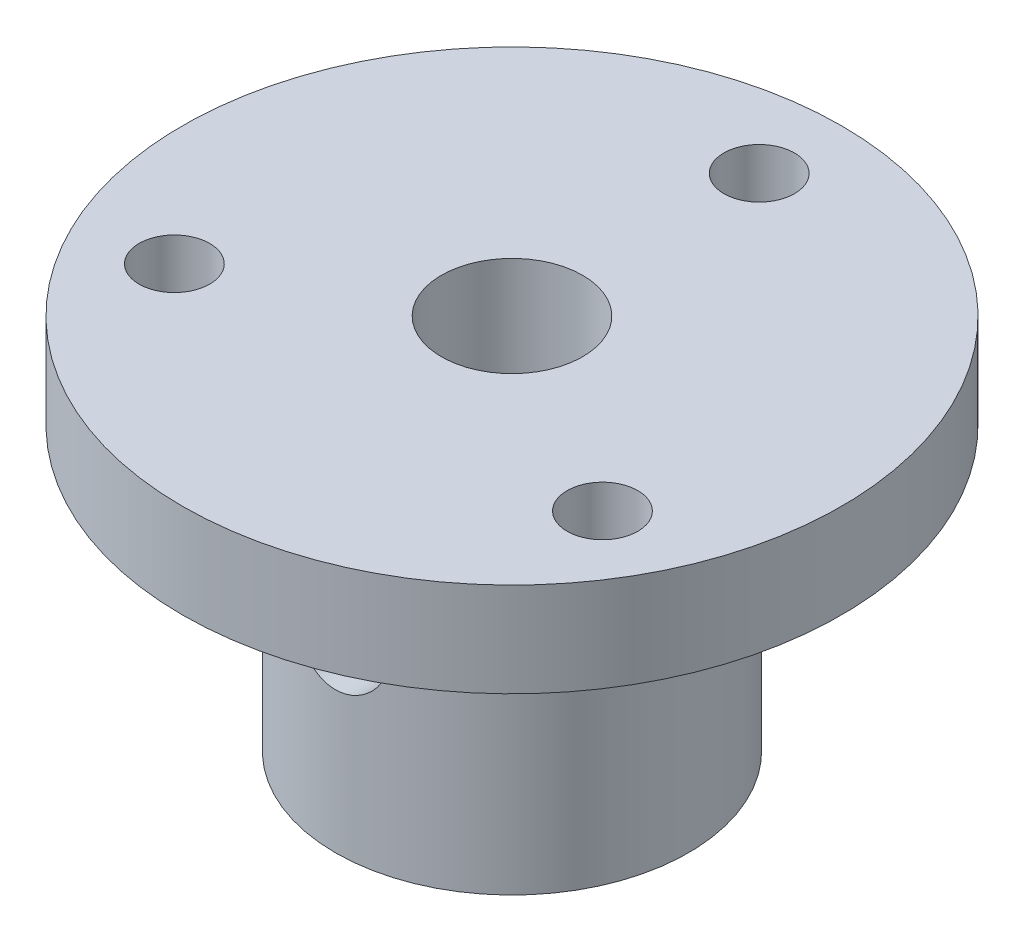
ISO-10303-21;
HEADER;
FILE_DESCRIPTION(('STEP AP214'),'2;1');
FILE_NAME('part.step','',(''),(''),'','','');
FILE_SCHEMA(('AUTOMOTIVE_DESIGN { 1 0 10303 214 1 1 1 1 }'));
ENDSEC;
DATA;
#1=APPLICATION_CONTEXT('core data for automotive mechanical design processes');
#2=APPLICATION_PROTOCOL_DEFINITION('international standard','automotive_design',2000,#1);
#3=PRODUCT_CONTEXT('',#1,'mechanical');
#4=PRODUCT('Part','Part','',(#3));
#5=PRODUCT_RELATED_PRODUCT_CATEGORY('part','',(#4));
#6=PRODUCT_DEFINITION_FORMATION('','',#4);
#7=PRODUCT_DEFINITION_CONTEXT('part definition',#1,'design');
#8=PRODUCT_DEFINITION('design','',#6,#7);
#9=PRODUCT_DEFINITION_SHAPE('','',#8);
#10=(LENGTH_UNIT() NAMED_UNIT(*) SI_UNIT(.MILLI.,.METRE.));
#11=(NAMED_UNIT(*) PLANE_ANGLE_UNIT() SI_UNIT($,.RADIAN.));
#12=(NAMED_UNIT(*) SI_UNIT($,.STERADIAN.) SOLID_ANGLE_UNIT());
#13=UNCERTAINTY_MEASURE_WITH_UNIT(LENGTH_MEASURE(1.E-05),#10,'distance_accuracy_value','');
#14=(GEOMETRIC_REPRESENTATION_CONTEXT(3) GLOBAL_UNCERTAINTY_ASSIGNED_CONTEXT((#13)) GLOBAL_UNIT_ASSIGNED_CONTEXT((#10,
#11,#12)) REPRESENTATION_CONTEXT('',''));
#15=CARTESIAN_POINT('',(0.,0.,0.));
#16=DIRECTION('',(0.,0.,1.));
#17=DIRECTION('',(1.,0.,0.));
#18=AXIS2_PLACEMENT_3D('',#15,#16,#17);
#19=CARTESIAN_POINT('',(0.,0.,0.));
#20=DIRECTION('',(0.,-1.,0.));
#21=DIRECTION('',(0.,0.,-1.));
#22=AXIS2_PLACEMENT_3D('',#19,#20,#21);
#23=CYLINDRICAL_SURFACE('',#22,3.);
#24=CARTESIAN_POINT('',(0.,16.,0.));
#25=DIRECTION('',(0.,-1.,0.));
#26=DIRECTION('',(0.,0.,-1.));
#27=AXIS2_PLACEMENT_3D('',#24,#25,#26);
#28=CIRCLE('',#27,3.);
#29=CARTESIAN_POINT('',(0.,16.,-3.));
#30=VERTEX_POINT('',#29);
#31=EDGE_CURVE('E43',#30,#30,#28,.T.);
#32=ORIENTED_EDGE('',*,*,#31,.F.);
#33=EDGE_LOOP('',(#32));
#34=FACE_BOUND('',#33,.T.);
#35=CARTESIAN_POINT('',(0.,0.,0.));
#36=DIRECTION('',(0.,-1.,0.));
#37=DIRECTION('',(0.,0.,-1.));
#38=AXIS2_PLACEMENT_3D('',#35,#36,#37);
#39=CIRCLE('',#38,3.);
#40=CARTESIAN_POINT('',(0.,0.,-3.));
#41=VERTEX_POINT('',#40);
#42=EDGE_CURVE('E10',#41,#41,#39,.T.);
#43=ORIENTED_EDGE('',*,*,#42,.T.);
#44=EDGE_LOOP('',(#43));
#45=FACE_BOUND('',#44,.T.);
#46=CARTESIAN_POINT('',(-2.,8.,2.23606797749979));
#47=CARTESIAN_POINT('',(-1.99999453997731,8.09762831086862,2.23607753462817));
#48=CARTESIAN_POINT('',(-1.99278992503664,8.1952907537088,2.24258071047442));
#49=CARTESIAN_POINT('',(-1.96458268317731,8.38711991165081,2.26731972501617));
#50=CARTESIAN_POINT('',(-1.94355530587862,8.48128003552957,2.2855766081271));
#51=CARTESIAN_POINT('',(-1.88935861676632,8.66273544187768,2.3305658582557));
#52=CARTESIAN_POINT('',(-1.85630718014214,8.75008769673766,2.35721561794601));
#53=CARTESIAN_POINT('',(-1.77934008393538,8.91786583234666,2.41584094681825));
#54=CARTESIAN_POINT('',(-1.73542216812163,8.99829026997647,2.44781762158831));
#55=CARTESIAN_POINT('',(-1.63002410007714,9.16364688761691,2.51946072932026));
#56=CARTESIAN_POINT('',(-1.56687435451732,9.2473321177172,2.55954936090364));
#57=CARTESIAN_POINT('',(-1.4281921974068,9.40400270887428,2.63944827308083));
#58=CARTESIAN_POINT('',(-1.3526477317708,9.47697752165853,2.67925824297985));
#59=CARTESIAN_POINT('',(-1.17815690494295,9.62064365878167,2.76088818523747));
#60=CARTESIAN_POINT('',(-1.07740643965819,9.68948251177567,2.80216785846923));
#61=CARTESIAN_POINT('',(-0.862470964212233,9.80864209549007,2.87558484482764));
#62=CARTESIAN_POINT('',(-0.748301152321705,9.85898351403119,2.90773236231037));
#63=CARTESIAN_POINT('',(-0.523249073480004,9.93355640101745,2.95599907464725));
#64=CARTESIAN_POINT('',(-0.413434725181417,9.96008334449556,2.97351175615867));
#65=CARTESIAN_POINT('',(-0.189695448729863,9.99418448928365,2.99609745461921));
#66=CARTESIAN_POINT('',(-0.0757758812858259,10.0017825592254,3.00118613762359));
#67=CARTESIAN_POINT('',(0.134147050232329,9.99782755005095,2.99855361722953));
#68=CARTESIAN_POINT('',(0.230240638008752,9.98901094868294,2.99266264910127));
#69=CARTESIAN_POINT('',(0.419238633271015,9.95790894864109,2.9720818279002));
#70=CARTESIAN_POINT('',(0.512142807649723,9.93562256769646,2.95739133313102));
#71=CARTESIAN_POINT('',(0.692077937671168,9.87880431520542,2.92052091703736));
#72=CARTESIAN_POINT('',(0.77913062384596,9.84432111480144,2.89837077982679));
#73=CARTESIAN_POINT('',(0.946209150653555,9.76444635704718,2.84821104476287));
#74=CARTESIAN_POINT('',(1.0262337049694,9.71905280849849,2.82020037745161));
#75=CARTESIAN_POINT('',(1.18828429196344,9.61202126254011,2.75618058450702));
#76=CARTESIAN_POINT('',(1.26919148099708,9.54903247664721,2.71960408792025));
#77=CARTESIAN_POINT('',(1.41998807498305,9.41210132051968,2.64400601826998));
#78=CARTESIAN_POINT('',(1.48986013519457,9.33814205406619,2.60498072815232));
#79=CARTESIAN_POINT('',(1.62772235326165,9.16803678978671,2.52150044944152));
#80=CARTESIAN_POINT('',(1.69373593126354,9.07022892028551,2.47714320008932));
#81=CARTESIAN_POINT('',(1.80834874945482,8.86249016077929,2.39475610831095));
#82=CARTESIAN_POINT('',(1.85697718654898,8.7525800055861,2.3567157153489));
#83=CARTESIAN_POINT('',(1.92332724567776,8.5552809379269,2.30262870306889));
#84=CARTESIAN_POINT('',(1.94590791747533,8.47040662994313,2.28340364577668));
#85=CARTESIAN_POINT('',(1.97979555580014,8.29696051018316,2.25409039789612));
#86=CARTESIAN_POINT('',(1.99112206964395,8.20839538882738,2.24398636782354));
#87=CARTESIAN_POINT('',(2.00179400148877,8.02955701355851,2.23447556987372));
#88=CARTESIAN_POINT('',(2.00108729753098,7.93927802147988,2.2351153386647));
#89=CARTESIAN_POINT('',(1.98761629716365,7.76031616604496,2.24709880368953));
#90=CARTESIAN_POINT('',(1.97484222690381,7.67163465589262,2.25845117648851));
#91=CARTESIAN_POINT('',(1.93899811187046,7.50261058245016,2.28927977500747));
#92=CARTESIAN_POINT('',(1.91646174529973,7.42207229099742,2.30833187069749));
#93=CARTESIAN_POINT('',(1.86223041628513,7.2658737639497,2.3522995853365));
#94=CARTESIAN_POINT('',(1.83053237805351,7.19021517703699,2.3772171729463));
#95=CARTESIAN_POINT('',(1.75163346599563,7.02979799615248,2.43611483596194));
#96=CARTESIAN_POINT('',(1.70260028818246,6.94624318845731,2.47091081434316));
#97=CARTESIAN_POINT('',(1.59352731501438,6.78758319738271,2.54262514806633));
#98=CARTESIAN_POINT('',(1.53347411883827,6.71248848325755,2.57954604947543));
#99=CARTESIAN_POINT('',(1.38876657712435,6.55603765253246,2.66075678321007));
#100=CARTESIAN_POINT('',(1.30160386514207,6.47689715175168,2.70489452138573));
#101=CARTESIAN_POINT('',(1.11309948866219,6.33418331705971,2.78775581841638));
#102=CARTESIAN_POINT('',(1.011770477457,6.27059622874327,2.82648414789457));
#103=CARTESIAN_POINT('',(0.817487474821797,6.17210826108241,2.88790821242222));
#104=CARTESIAN_POINT('',(0.726662364886321,6.13404349555963,2.91225458111008));
#105=CARTESIAN_POINT('',(0.538757079020516,6.07139280567956,2.95278707867041));
#106=CARTESIAN_POINT('',(0.44168226385877,6.04679549714023,2.96898009871993));
#107=CARTESIAN_POINT('',(0.243369392303444,6.01230303616125,2.99178364026746));
#108=CARTESIAN_POINT('',(0.142114836924319,6.00247332049333,2.99835150856532));
#109=CARTESIAN_POINT('',(-0.0608555465807309,5.9983521485829,3.00109821029056));
#110=CARTESIAN_POINT('',(-0.162571330953447,6.00405924804382,2.99727800938901));
#111=CARTESIAN_POINT('',(-0.355757532528106,6.0296594890047,2.98029555977323));
#112=CARTESIAN_POINT('',(-0.447435143070531,6.04849098486181,2.96783277209856));
#113=CARTESIAN_POINT('',(-0.626018422997062,6.0982380094309,2.93536106206933));
#114=CARTESIAN_POINT('',(-0.71292334868689,6.12915541534726,2.91535096747103));
#115=CARTESIAN_POINT('',(-0.885147296608351,6.20393870488403,2.86791765486194));
#116=CARTESIAN_POINT('',(-0.970083589200265,6.24845030749508,2.84013248946338));
#117=CARTESIAN_POINT('',(-1.13155266268318,6.34815064462598,2.77975408235472));
#118=CARTESIAN_POINT('',(-1.20808037205002,6.403345767952,2.74715796645263));
#119=CARTESIAN_POINT('',(-1.36329422201402,6.53262890233631,2.67392931472394));
#120=CARTESIAN_POINT('',(-1.44042679526091,6.60832302367404,2.6328391387737));
#121=CARTESIAN_POINT('',(-1.58160022281596,6.77111354154584,2.55053357649486));
#122=CARTESIAN_POINT('',(-1.64563128323923,6.85821838883409,2.50931811970155));
#123=CARTESIAN_POINT('',(-1.75513253518411,7.03586759075529,2.43384213590298));
#124=CARTESIAN_POINT('',(-1.8016464689721,7.12564180995034,2.39929086741904));
#125=CARTESIAN_POINT('',(-1.88115802340272,7.31328444899316,2.33747501591022));
#126=CARTESIAN_POINT('',(-1.91418190281333,7.41113669386215,2.31019631295305));
#127=CARTESIAN_POINT('',(-1.95936262470908,7.59077146842455,2.27191051929539));
#128=CARTESIAN_POINT('',(-1.97452228373248,7.6713082367903,2.25863695410151));
#129=CARTESIAN_POINT('',(-1.99483915818926,7.83455640050454,2.24071519216009));
#130=CARTESIAN_POINT('',(-2.00000462703715,7.91726594426058,2.23605987841475));
#131=CARTESIAN_POINT('',(-2.,8.,2.23606797749979));
#132=B_SPLINE_CURVE_WITH_KNOTS('',3,(#46,#47,#48,#49,#50,#51,#52,#53,#54,#55,#56,#57,#58,#59,
#60,#61,#62,#63,#64,#65,#66,#67,#68,#69,#70,#71,#72,#73,#74,#75,#76,#77,#78,#79,#80,#81,#82,#83,
#84,#85,#86,#87,#88,#89,#90,#91,#92,#93,#94,#95,#96,#97,#98,#99,#100,#101,#102,#103,#104,#105,
#106,#107,#108,#109,#110,#111,#112,#113,#114,#115,#116,#117,#118,#119,#120,#121,#122,#123,#124,
#125,#126,#127,#128,#129,#130,#131),.UNSPECIFIED.,.T.,.F.,(4,2,2,2,2,2,2,2,2,2,2,2,2,2,2,2,2,2,
2,2,2,2,2,2,2,2,2,2,2,2,2,2,2,2,2,2,2,2,2,2,2,2,4),(0.,0.292506930722154,0.585539042259288,
0.875772651216272,1.16606657266549,1.50154677068638,1.83735518436276,2.22167031006289,
2.6055542938858,2.94637482063579,3.28676536688298,3.57539534955742,3.86404638283746,
4.15155831973191,4.43912276903,4.76447525946635,5.09033414796638,5.46678703504943,
5.84260469743948,6.11126090401324,6.37944966235486,6.64880037638036,6.91836943570597,
7.17476451706936,7.43124577644957,7.73899230052351,8.04711556801509,8.42254684520963,
8.7976449057258,9.10070580611698,9.40351012888472,9.70765229266164,10.0117661844615,
10.2937678224973,10.5758132789284,10.874178629859,11.1727229593109,11.5182220628451,
11.863978504186,12.1833412579672,12.5020793664923,12.7501661630426,12.9980479966543),.UNSPECIFIED.);
#133=CARTESIAN_POINT('',(-2.,8.,2.23606797749979));
#134=VERTEX_POINT('',#133);
#135=EDGE_CURVE('E96',#134,#134,#132,.T.);
#136=ORIENTED_EDGE('',*,*,#135,.F.);
#137=EDGE_LOOP('',(#136));
#138=FACE_BOUND('',#137,.T.);
#139=ADVANCED_FACE('F30',(#34,#45,#138),#23,.F.);
#140=CARTESIAN_POINT('',(0.,0.,0.));
#141=DIRECTION('',(0.,-1.,0.));
#142=DIRECTION('',(0.,0.,-1.));
#143=AXIS2_PLACEMENT_3D('',#140,#141,#142);
#144=CYLINDRICAL_SURFACE('',#143,7.5);
#145=CARTESIAN_POINT('',(0.,0.,0.));
#146=DIRECTION('',(0.,-1.,0.));
#147=DIRECTION('',(0.,0.,-1.));
#148=AXIS2_PLACEMENT_3D('',#145,#146,#147);
#149=CIRCLE('',#148,7.5);
#150=CARTESIAN_POINT('',(0.,0.,-7.5));
#151=VERTEX_POINT('',#150);
#152=EDGE_CURVE('E55',#151,#151,#149,.T.);
#153=ORIENTED_EDGE('',*,*,#152,.F.);
#154=EDGE_LOOP('',(#153));
#155=FACE_BOUND('',#154,.T.);
#156=CARTESIAN_POINT('',(0.,12.,0.));
#157=DIRECTION('',(0.,-1.,0.));
#158=DIRECTION('',(0.,0.,-1.));
#159=AXIS2_PLACEMENT_3D('',#156,#157,#158);
#160=CIRCLE('',#159,7.5);
#161=CARTESIAN_POINT('',(0.,12.,-7.5));
#162=VERTEX_POINT('',#161);
#163=EDGE_CURVE('E74',#162,#162,#160,.T.);
#164=ORIENTED_EDGE('',*,*,#163,.T.);
#165=EDGE_LOOP('',(#164));
#166=FACE_BOUND('',#165,.T.);
#167=CARTESIAN_POINT('',(-2.,8.,7.22841614740048));
#168=CARTESIAN_POINT('',(-1.99999734315871,7.88982406225972,7.22841805697251));
#169=CARTESIAN_POINT('',(-1.99086493224742,7.77961999952398,7.23096264549673));
#170=CARTESIAN_POINT('',(-1.95464583260237,7.56239457844363,7.24083561155097));
#171=CARTESIAN_POINT('',(-1.92755013620953,7.45537484502194,7.24816638907934));
#172=CARTESIAN_POINT('',(-1.85635845560073,7.24769193005322,7.26672375176839));
#173=CARTESIAN_POINT('',(-1.81228637542178,7.14702004117157,7.27794485684204));
#174=CARTESIAN_POINT('',(-1.70846784563703,6.95448325994017,7.30301154920401));
#175=CARTESIAN_POINT('',(-1.6487201784145,6.86261905249301,7.31685734034424));
#176=CARTESIAN_POINT('',(-1.51364847874559,6.68800745301228,7.34600139553467));
#177=CARTESIAN_POINT('',(-1.43800297504208,6.60551298253554,7.36132541116443));
#178=CARTESIAN_POINT('',(-1.27397427284021,6.4542184230488,7.39147701436507));
#179=CARTESIAN_POINT('',(-1.18558975534664,6.38541975385821,7.40630455033439));
#180=CARTESIAN_POINT('',(-0.996838170873269,6.26241506159707,7.43407988468418));
#181=CARTESIAN_POINT('',(-0.896301819879479,6.20846048136714,7.44699376262293));
#182=CARTESIAN_POINT('',(-0.68718304472909,6.11831536463274,7.46919126211834));
#183=CARTESIAN_POINT('',(-0.578601980875103,6.08212183271844,7.47847549576262));
#184=CARTESIAN_POINT('',(-0.35911596181009,6.02934477976423,7.49218553576461));
#185=CARTESIAN_POINT('',(-0.248321224200916,6.01233102337408,7.49671776750265));
#186=CARTESIAN_POINT('',(-0.0253635535085752,5.99704287989282,7.50078524617749));
#187=CARTESIAN_POINT('',(0.0867991474385301,5.99876535636986,7.50032132946608));
#188=CARTESIAN_POINT('',(0.306314237111347,6.02059781253947,7.49452675859765));
#189=CARTESIAN_POINT('',(0.41371660072111,6.04024295763629,7.48931914026999));
#190=CARTESIAN_POINT('',(0.623641315571055,6.09661213778195,7.4747674859047));
#191=CARTESIAN_POINT('',(0.72616338818058,6.13333714668604,7.46542321400589));
#192=CARTESIAN_POINT('',(0.924603945147554,6.22317984759238,7.44346569099892));
#193=CARTESIAN_POINT('',(1.02044668632954,6.2764568071007,7.43082087877672));
#194=CARTESIAN_POINT('',(1.20198999876452,6.3977688195091,7.40362468509504));
#195=CARTESIAN_POINT('',(1.28768858808586,6.46580674902818,7.38907293223));
#196=CARTESIAN_POINT('',(1.44928536946561,6.61717685793391,7.35911272938718));
#197=CARTESIAN_POINT('',(1.52480192017773,6.70091444504936,7.34369169368738));
#198=CARTESIAN_POINT('',(1.6608133210477,6.88002467623882,7.31413405023521));
#199=CARTESIAN_POINT('',(1.72130725529808,6.97539802920045,7.29999752083065));
#200=CARTESIAN_POINT('',(1.82584679186274,7.17590010182131,7.27455902280777));
#201=CARTESIAN_POINT('',(1.86978866600526,7.28108535091316,7.26327507092156));
#202=CARTESIAN_POINT('',(1.93924001685674,7.49772649945497,7.24504325087515));
#203=CARTESIAN_POINT('',(1.96475406461341,7.60918083645033,7.23809430746845));
#204=CARTESIAN_POINT('',(1.99596757092855,7.83162721102836,7.22954835612976));
#205=CARTESIAN_POINT('',(2.00223632621177,7.94253354862131,7.22779763213456));
#206=CARTESIAN_POINT('',(1.9963498112297,8.16380977280855,7.22942578390815));
#207=CARTESIAN_POINT('',(1.98419650172323,8.27417971523995,7.23280411376438));
#208=CARTESIAN_POINT('',(1.94231271869971,8.48905659409155,7.24416124318865));
#209=CARTESIAN_POINT('',(1.91292447912922,8.59363543793723,7.25205039699299));
#210=CARTESIAN_POINT('',(1.83778986725474,8.79637963135993,7.27145268952784));
#211=CARTESIAN_POINT('',(1.79204135876651,8.89454414142742,7.28296630148563));
#212=CARTESIAN_POINT('',(1.68432905508707,9.08405495743521,7.30863572472984));
#213=CARTESIAN_POINT('',(1.62203095237924,9.17520397588973,7.32284404872864));
#214=CARTESIAN_POINT('',(1.48340227987515,9.34596330170316,7.35217841933666));
#215=CARTESIAN_POINT('',(1.40706907222967,9.42557143495415,7.36730463810238));
#216=CARTESIAN_POINT('',(1.23990378250484,9.57335247324992,7.39729964884456));
#217=CARTESIAN_POINT('',(1.14871641600885,9.64112837697858,7.41214836523848));
#218=CARTESIAN_POINT('',(0.955928435940742,9.76041098741052,7.43946670017127));
#219=CARTESIAN_POINT('',(0.854328377018883,9.81191856007892,7.45193644532905));
#220=CARTESIAN_POINT('',(0.644314134825872,9.89672963236151,7.47301150899261));
#221=CARTESIAN_POINT('',(0.535957852882337,9.93016901944347,7.48164558480385));
#222=CARTESIAN_POINT('',(0.314899384731319,9.97828872806436,7.49420303787247));
#223=CARTESIAN_POINT('',(0.202198167320243,9.99297320677468,7.4981274590498));
#224=CARTESIAN_POINT('',(-0.0206420013461489,10.0029058237414,7.50077413437691));
#225=CARTESIAN_POINT('',(-0.130753511527863,9.99873631913117,7.49965226288082));
#226=CARTESIAN_POINT('',(-0.348648304630717,9.97243150642479,7.4926849097886));
#227=CARTESIAN_POINT('',(-0.456431674812814,9.95029687288295,7.48683960554786));
#228=CARTESIAN_POINT('',(-0.66591012346421,9.8890193950814,7.47111310390923));
#229=CARTESIAN_POINT('',(-0.767642011851541,9.84999470652756,7.46125997189229));
#230=CARTESIAN_POINT('',(-0.963172098471354,9.75615039825376,7.43854816516494));
#231=CARTESIAN_POINT('',(-1.05696918166215,9.70132856338719,7.42568906899253));
#232=CARTESIAN_POINT('',(-1.23667826867367,9.57574172786298,7.39791331224121));
#233=CARTESIAN_POINT('',(-1.32231336173331,9.50459061930134,7.38295093371635));
#234=CARTESIAN_POINT('',(-1.48062537156133,9.34909725063509,7.35284000077256));
#235=CARTESIAN_POINT('',(-1.55329887243048,9.26475152418065,7.33769139839721));
#236=CARTESIAN_POINT('',(-1.68520700232562,9.0830316041824,7.30853959638856));
#237=CARTESIAN_POINT('',(-1.74411094261233,8.98541168634279,7.29456891224646));
#238=CARTESIAN_POINT('',(-1.84458689030054,8.78129368913976,7.26981393903472));
#239=CARTESIAN_POINT('',(-1.88617023367332,8.67480147146052,7.25902756724947));
#240=CARTESIAN_POINT('',(-1.94538124252481,8.47391866394875,7.24336000653874));
#241=CARTESIAN_POINT('',(-1.96581518399489,8.38039873544328,7.23780140272195));
#242=CARTESIAN_POINT('',(-1.9931249429388,8.19125944200603,7.2303288521157));
#243=CARTESIAN_POINT('',(-2.0000023063216,8.09564031771119,7.22841448976016));
#244=CARTESIAN_POINT('',(-2.,8.,7.22841614740048));
#245=B_SPLINE_CURVE_WITH_KNOTS('',3,(#167,#168,#169,#170,#171,#172,#173,#174,#175,#176,#177,
#178,#179,#180,#181,#182,#183,#184,#185,#186,#187,#188,#189,#190,#191,#192,#193,#194,#195,#196,
#197,#198,#199,#200,#201,#202,#203,#204,#205,#206,#207,#208,#209,#210,#211,#212,#213,#214,#215,
#216,#217,#218,#219,#220,#221,#222,#223,#224,#225,#226,#227,#228,#229,#230,#231,#232,#233,#234,
#235,#236,#237,#238,#239,#240,#241,#242,#243,#244),.UNSPECIFIED.,.T.,.F.,(4,2,2,2,2,2,2,2,2,2,2,
2,2,2,2,2,2,2,2,2,2,2,2,2,2,2,2,2,2,2,2,2,2,2,2,2,2,2,4),(0.,0.330176128116025,
0.660517947850201,0.990396311596168,1.32030030656105,1.65765916130211,1.99505297124461,
2.33785207370803,2.68059334304246,3.0154830431648,3.35031668385603,3.67670570800803,
4.00311334440695,4.3327644890557,4.66247993394491,5.00231762300329,5.34217602639579,
5.68413015096536,6.02599942418508,6.35765334242023,6.68927196343503,7.01451850432574,
7.33980752864823,7.67224634967772,8.00474771541474,8.34685906959633,8.68895221008103,
9.02843539591401,9.36784331959005,9.69684054916463,10.0258254261296,10.3525451486867,
10.6793107076596,11.0147885399158,11.3503546538105,11.6933003898558,12.0360213210131,
12.3226696767153,12.6092853429065),.UNSPECIFIED.);
#246=CARTESIAN_POINT('',(-2.,8.,7.22841614740048));
#247=VERTEX_POINT('',#246);
#248=EDGE_CURVE('E34',#247,#247,#245,.T.);
#249=ORIENTED_EDGE('',*,*,#248,.F.);
#250=EDGE_LOOP('',(#249));
#251=FACE_BOUND('',#250,.T.);
#252=ADVANCED_FACE('F92',(#155,#166,#251),#144,.T.);
#253=CARTESIAN_POINT('',(-7.5,0.,0.));
#254=DIRECTION('',(0.,1.,0.));
#255=DIRECTION('',(0.,0.,1.));
#256=AXIS2_PLACEMENT_3D('',#253,#254,#255);
#257=PLANE('',#256);
#258=ORIENTED_EDGE('',*,*,#42,.F.);
#259=EDGE_LOOP('',(#258));
#260=FACE_BOUND('',#259,.T.);
#261=ORIENTED_EDGE('',*,*,#152,.T.);
#262=EDGE_LOOP('',(#261));
#263=FACE_BOUND('',#262,.T.);
#264=ADVANCED_FACE('F32',(#260,#263),#257,.F.);
#265=CARTESIAN_POINT('',(-3.,16.,0.));
#266=DIRECTION('',(0.,-1.,0.));
#267=DIRECTION('',(0.,0.,-1.));
#268=AXIS2_PLACEMENT_3D('',#265,#266,#267);
#269=PLANE('',#268);
#270=CARTESIAN_POINT('',(-9.09326673973658,16.,5.25000000000004));
#271=DIRECTION('',(0.,1.,0.));
#272=DIRECTION('',(0.,0.,1.));
#273=AXIS2_PLACEMENT_3D('',#270,#271,#272);
#274=CIRCLE('',#273,1.5);
#275=CARTESIAN_POINT('',(-9.09326673973658,16.,6.75000000000004));
#276=VERTEX_POINT('',#275);
#277=EDGE_CURVE('E60',#276,#276,#274,.T.);
#278=ORIENTED_EDGE('',*,*,#277,.F.);
#279=EDGE_LOOP('',(#278));
#280=FACE_BOUND('',#279,.T.);
#281=CARTESIAN_POINT('',(0.,16.,-10.5));
#282=DIRECTION('',(0.,1.,0.));
#283=DIRECTION('',(0.,0.,1.));
#284=AXIS2_PLACEMENT_3D('',#281,#282,#283);
#285=CIRCLE('',#284,1.5);
#286=CARTESIAN_POINT('',(0.,16.,-9.));
#287=VERTEX_POINT('',#286);
#288=EDGE_CURVE('E70',#287,#287,#285,.T.);
#289=ORIENTED_EDGE('',*,*,#288,.F.);
#290=EDGE_LOOP('',(#289));
#291=FACE_BOUND('',#290,.T.);
#292=CARTESIAN_POINT('',(9.09326673973662,16.,5.24999999999998));
#293=DIRECTION('',(0.,1.,0.));
#294=DIRECTION('',(0.,0.,1.));
#295=AXIS2_PLACEMENT_3D('',#292,#293,#294);
#296=CIRCLE('',#295,1.5);
#297=CARTESIAN_POINT('',(9.09326673973662,16.,6.74999999999998));
#298=VERTEX_POINT('',#297);
#299=EDGE_CURVE('E56',#298,#298,#296,.T.);
#300=ORIENTED_EDGE('',*,*,#299,.F.);
#301=EDGE_LOOP('',(#300));
#302=FACE_BOUND('',#301,.T.);
#303=CARTESIAN_POINT('',(0.,16.,0.));
#304=DIRECTION('',(0.,-1.,0.));
#305=DIRECTION('',(0.,0.,-1.));
#306=AXIS2_PLACEMENT_3D('',#303,#304,#305);
#307=CIRCLE('',#306,14.);
#308=CARTESIAN_POINT('',(0.,16.,-14.));
#309=VERTEX_POINT('',#308);
#310=EDGE_CURVE('E48',#309,#309,#307,.T.);
#311=ORIENTED_EDGE('',*,*,#310,.F.);
#312=EDGE_LOOP('',(#311));
#313=FACE_BOUND('',#312,.T.);
#314=ORIENTED_EDGE('',*,*,#31,.T.);
#315=EDGE_LOOP('',(#314));
#316=FACE_BOUND('',#315,.T.);
#317=ADVANCED_FACE('F84',(#280,#291,#302,#313,#316),#269,.F.);
#318=CARTESIAN_POINT('',(0.,0.,0.));
#319=DIRECTION('',(0.,-1.,0.));
#320=DIRECTION('',(0.,0.,-1.));
#321=AXIS2_PLACEMENT_3D('',#318,#319,#320);
#322=CYLINDRICAL_SURFACE('',#321,14.);
#323=CARTESIAN_POINT('',(0.,12.,0.));
#324=DIRECTION('',(0.,-1.,0.));
#325=DIRECTION('',(0.,0.,-1.));
#326=AXIS2_PLACEMENT_3D('',#323,#324,#325);
#327=CIRCLE('',#326,14.);
#328=CARTESIAN_POINT('',(0.,12.,-14.));
#329=VERTEX_POINT('',#328);
#330=EDGE_CURVE('E77',#329,#329,#327,.T.);
#331=ORIENTED_EDGE('',*,*,#330,.F.);
#332=EDGE_LOOP('',(#331));
#333=FACE_BOUND('',#332,.T.);
#334=ORIENTED_EDGE('',*,*,#310,.T.);
#335=EDGE_LOOP('',(#334));
#336=FACE_BOUND('',#335,.T.);
#337=ADVANCED_FACE('F82',(#333,#336),#322,.T.);
#338=CARTESIAN_POINT('',(-14.,12.,0.));
#339=DIRECTION('',(0.,1.,0.));
#340=DIRECTION('',(0.,0.,1.));
#341=AXIS2_PLACEMENT_3D('',#338,#339,#340);
#342=PLANE('',#341);
#343=CARTESIAN_POINT('',(-9.09326673973658,12.,5.25000000000004));
#344=DIRECTION('',(0.,1.,0.));
#345=DIRECTION('',(0.,0.,1.));
#346=AXIS2_PLACEMENT_3D('',#343,#344,#345);
#347=CIRCLE('',#346,1.5);
#348=CARTESIAN_POINT('',(-9.09326673973658,12.,6.75000000000004));
#349=VERTEX_POINT('',#348);
#350=EDGE_CURVE('E59',#349,#349,#347,.T.);
#351=ORIENTED_EDGE('',*,*,#350,.T.);
#352=EDGE_LOOP('',(#351));
#353=FACE_BOUND('',#352,.T.);
#354=CARTESIAN_POINT('',(0.,12.,-10.5));
#355=DIRECTION('',(0.,1.,0.));
#356=DIRECTION('',(0.,0.,1.));
#357=AXIS2_PLACEMENT_3D('',#354,#355,#356);
#358=CIRCLE('',#357,1.5);
#359=CARTESIAN_POINT('',(0.,12.,-9.));
#360=VERTEX_POINT('',#359);
#361=EDGE_CURVE('E57',#360,#360,#358,.T.);
#362=ORIENTED_EDGE('',*,*,#361,.T.);
#363=EDGE_LOOP('',(#362));
#364=FACE_BOUND('',#363,.T.);
#365=CARTESIAN_POINT('',(9.09326673973662,12.,5.24999999999998));
#366=DIRECTION('',(0.,1.,0.));
#367=DIRECTION('',(0.,0.,1.));
#368=AXIS2_PLACEMENT_3D('',#365,#366,#367);
#369=CIRCLE('',#368,1.5);
#370=CARTESIAN_POINT('',(9.09326673973662,12.,6.74999999999998));
#371=VERTEX_POINT('',#370);
#372=EDGE_CURVE('E52',#371,#371,#369,.T.);
#373=ORIENTED_EDGE('',*,*,#372,.T.);
#374=EDGE_LOOP('',(#373));
#375=FACE_BOUND('',#374,.T.);
#376=ORIENTED_EDGE('',*,*,#163,.F.);
#377=EDGE_LOOP('',(#376));
#378=FACE_BOUND('',#377,.T.);
#379=ORIENTED_EDGE('',*,*,#330,.T.);
#380=EDGE_LOOP('',(#379));
#381=FACE_BOUND('',#380,.T.);
#382=ADVANCED_FACE('F121',(#353,#364,#375,#378,#381),#342,.F.);
#383=CARTESIAN_POINT('',(9.09326673973662,0.,5.24999999999998));
#384=DIRECTION('',(0.,1.,0.));
#385=DIRECTION('',(0.,0.,1.));
#386=AXIS2_PLACEMENT_3D('',#383,#384,#385);
#387=CYLINDRICAL_SURFACE('',#386,1.5);
#388=ORIENTED_EDGE('',*,*,#299,.T.);
#389=EDGE_LOOP('',(#388));
#390=FACE_BOUND('',#389,.T.);
#391=ORIENTED_EDGE('',*,*,#372,.F.);
#392=EDGE_LOOP('',(#391));
#393=FACE_BOUND('',#392,.T.);
#394=ADVANCED_FACE('F118',(#390,#393),#387,.F.);
#395=CARTESIAN_POINT('',(0.,0.,-10.5));
#396=DIRECTION('',(0.,1.,0.));
#397=DIRECTION('',(0.,0.,1.));
#398=AXIS2_PLACEMENT_3D('',#395,#396,#397);
#399=CYLINDRICAL_SURFACE('',#398,1.5);
#400=ORIENTED_EDGE('',*,*,#288,.T.);
#401=EDGE_LOOP('',(#400));
#402=FACE_BOUND('',#401,.T.);
#403=ORIENTED_EDGE('',*,*,#361,.F.);
#404=EDGE_LOOP('',(#403));
#405=FACE_BOUND('',#404,.T.);
#406=ADVANCED_FACE('F114',(#402,#405),#399,.F.);
#407=CARTESIAN_POINT('',(-9.09326673973658,0.,5.25000000000004));
#408=DIRECTION('',(0.,1.,0.));
#409=DIRECTION('',(0.,0.,1.));
#410=AXIS2_PLACEMENT_3D('',#407,#408,#409);
#411=CYLINDRICAL_SURFACE('',#410,1.5);
#412=ORIENTED_EDGE('',*,*,#277,.T.);
#413=EDGE_LOOP('',(#412));
#414=FACE_BOUND('',#413,.T.);
#415=ORIENTED_EDGE('',*,*,#350,.F.);
#416=EDGE_LOOP('',(#415));
#417=FACE_BOUND('',#416,.T.);
#418=ADVANCED_FACE('F109',(#414,#417),#411,.F.);
#419=CARTESIAN_POINT('',(0.,8.,14.));
#420=DIRECTION('',(0.,0.,-1.));
#421=DIRECTION('',(-1.,0.,0.));
#422=AXIS2_PLACEMENT_3D('',#419,#420,#421);
#423=CYLINDRICAL_SURFACE('',#422,2.);
#424=ORIENTED_EDGE('',*,*,#248,.T.);
#425=EDGE_LOOP('',(#424));
#426=FACE_BOUND('',#425,.T.);
#427=ORIENTED_EDGE('',*,*,#135,.T.);
#428=EDGE_LOOP('',(#427));
#429=FACE_BOUND('',#428,.T.);
#430=ADVANCED_FACE('F105',(#426,#429),#423,.F.);
#431=CLOSED_SHELL('',(#139,#252,#264,#317,#337,#382,#394,#406,#418,#430));
#432=MANIFOLD_SOLID_BREP('B2',#431);
#433=ADVANCED_BREP_SHAPE_REPRESENTATION('',(#18,#432),#14);
#434=SHAPE_DEFINITION_REPRESENTATION(#9,#433);
ENDSEC;
END-ISO-10303-21;
